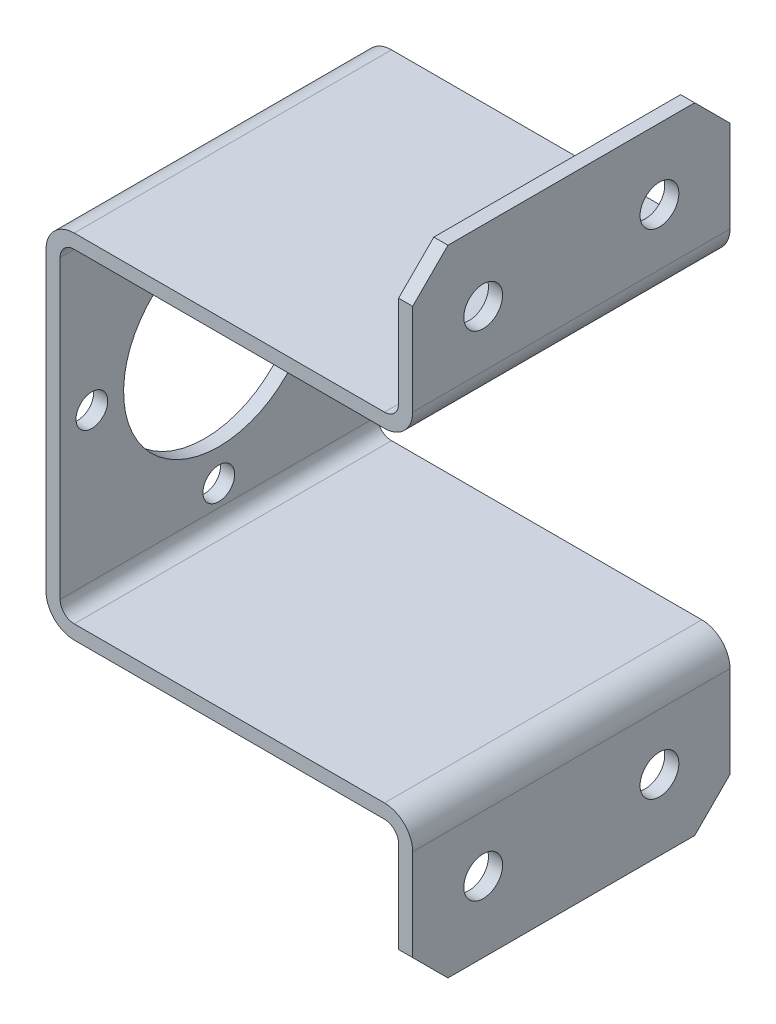
ISO-10303-21;
HEADER;
FILE_DESCRIPTION(('STEP AP214'),'2;1');
FILE_NAME('part.step','',(''),(''),'','','');
FILE_SCHEMA(('AUTOMOTIVE_DESIGN { 1 0 10303 214 1 1 1 1 }'));
ENDSEC;
DATA;
#1=APPLICATION_CONTEXT('core data for automotive mechanical design processes');
#2=APPLICATION_PROTOCOL_DEFINITION('international standard','automotive_design',2000,#1);
#3=PRODUCT_CONTEXT('',#1,'mechanical');
#4=PRODUCT('Part','Part','',(#3));
#5=PRODUCT_RELATED_PRODUCT_CATEGORY('part','',(#4));
#6=PRODUCT_DEFINITION_FORMATION('','',#4);
#7=PRODUCT_DEFINITION_CONTEXT('part definition',#1,'design');
#8=PRODUCT_DEFINITION('design','',#6,#7);
#9=PRODUCT_DEFINITION_SHAPE('','',#8);
#10=(LENGTH_UNIT() NAMED_UNIT(*) SI_UNIT(.MILLI.,.METRE.));
#11=(NAMED_UNIT(*) PLANE_ANGLE_UNIT() SI_UNIT($,.RADIAN.));
#12=(NAMED_UNIT(*) SI_UNIT($,.STERADIAN.) SOLID_ANGLE_UNIT());
#13=UNCERTAINTY_MEASURE_WITH_UNIT(LENGTH_MEASURE(1.E-05),#10,'distance_accuracy_value','');
#14=(GEOMETRIC_REPRESENTATION_CONTEXT(3) GLOBAL_UNCERTAINTY_ASSIGNED_CONTEXT((#13)) GLOBAL_UNIT_ASSIGNED_CONTEXT((#10,
#11,#12)) REPRESENTATION_CONTEXT('',''));
#15=CARTESIAN_POINT('',(0.,0.,0.));
#16=DIRECTION('',(0.,0.,1.));
#17=DIRECTION('',(1.,0.,0.));
#18=AXIS2_PLACEMENT_3D('',#15,#16,#17);
#19=CARTESIAN_POINT('',(50.,70.,22.5));
#20=DIRECTION('',(1.,0.,0.));
#21=DIRECTION('',(0.,0.,-1.));
#22=AXIS2_PLACEMENT_3D('',#19,#20,#21);
#23=PLANE('',#22);
#24=CARTESIAN_POINT('',(50.,60.,12.5));
#25=DIRECTION('',(-1.,0.,0.));
#26=DIRECTION('',(0.,0.,1.));
#27=AXIS2_PLACEMENT_3D('',#24,#25,#26);
#28=CIRCLE('',#27,2.75);
#29=CARTESIAN_POINT('',(50.,60.,15.25));
#30=VERTEX_POINT('',#29);
#31=EDGE_CURVE('E423',#30,#30,#28,.T.);
#32=ORIENTED_EDGE('',*,*,#31,.F.);
#33=EDGE_LOOP('',(#32));
#34=FACE_BOUND('',#33,.T.);
#35=DIRECTION('',(0.,0.,-1.));
#36=VECTOR('',#35,1.);
#37=CARTESIAN_POINT('',(50.,70.,22.5));
#38=LINE('',#37,#36);
#39=CARTESIAN_POINT('',(50.,70.,17.5));
#40=VERTEX_POINT('',#39);
#41=CARTESIAN_POINT('',(50.,70.,-17.5));
#42=VERTEX_POINT('',#41);
#43=EDGE_CURVE('E240',#40,#42,#38,.T.);
#44=ORIENTED_EDGE('',*,*,#43,.T.);
#45=DIRECTION('',(0.,0.707106781186549,0.707106781186547));
#46=VECTOR('',#45,1.);
#47=CARTESIAN_POINT('',(50.,70.,-17.5));
#48=LINE('',#47,#46);
#49=CARTESIAN_POINT('',(50.,65.,-22.5));
#50=VERTEX_POINT('',#49);
#51=EDGE_CURVE('E283',#42,#50,#48,.F.);
#52=ORIENTED_EDGE('',*,*,#51,.T.);
#53=DIRECTION('',(0.,-1.,0.));
#54=VECTOR('',#53,1.);
#55=CARTESIAN_POINT('',(50.,70.,-22.5));
#56=LINE('',#55,#54);
#57=CARTESIAN_POINT('',(50.,52.,-22.5));
#58=VERTEX_POINT('',#57);
#59=EDGE_CURVE('E355',#50,#58,#56,.T.);
#60=ORIENTED_EDGE('',*,*,#59,.T.);
#61=DIRECTION('',(0.,0.,-1.));
#62=VECTOR('',#61,1.);
#63=CARTESIAN_POINT('',(50.,52.,22.5));
#64=LINE('',#63,#62);
#65=CARTESIAN_POINT('',(50.,52.,22.5));
#66=VERTEX_POINT('',#65);
#67=EDGE_CURVE('E254',#58,#66,#64,.F.);
#68=ORIENTED_EDGE('',*,*,#67,.T.);
#69=DIRECTION('',(0.,-1.,0.));
#70=VECTOR('',#69,1.);
#71=CARTESIAN_POINT('',(50.,70.,22.5));
#72=LINE('',#71,#70);
#73=CARTESIAN_POINT('',(50.,65.,22.5));
#74=VERTEX_POINT('',#73);
#75=EDGE_CURVE('E403',#74,#66,#72,.T.);
#76=ORIENTED_EDGE('',*,*,#75,.F.);
#77=DIRECTION('',(0.,0.707106781186547,-0.707106781186547));
#78=VECTOR('',#77,1.);
#79=CARTESIAN_POINT('',(50.,65.,22.5));
#80=LINE('',#79,#78);
#81=EDGE_CURVE('E281',#74,#40,#80,.T.);
#82=ORIENTED_EDGE('',*,*,#81,.T.);
#83=EDGE_LOOP('',(#44,#52,#60,#68,#76,#82));
#84=FACE_BOUND('',#83,.T.);
#85=CARTESIAN_POINT('',(50.,60.,-12.5));
#86=DIRECTION('',(-1.,0.,0.));
#87=DIRECTION('',(0.,0.,1.));
#88=AXIS2_PLACEMENT_3D('',#85,#86,#87);
#89=CIRCLE('',#88,2.75);
#90=CARTESIAN_POINT('',(50.,60.,-9.75));
#91=VERTEX_POINT('',#90);
#92=EDGE_CURVE('E417',#91,#91,#89,.T.);
#93=ORIENTED_EDGE('',*,*,#92,.F.);
#94=EDGE_LOOP('',(#93));
#95=FACE_BOUND('',#94,.T.);
#96=ADVANCED_FACE('F34',(#34,#84,#95),#23,.F.);
#97=CARTESIAN_POINT('',(52.,48.,22.5));
#98=DIRECTION('',(-1.,0.,0.));
#99=DIRECTION('',(0.,-1.,0.));
#100=AXIS2_PLACEMENT_3D('',#97,#98,#99);
#101=PLANE('',#100);
#102=CARTESIAN_POINT('',(52.,60.,12.5));
#103=DIRECTION('',(-1.,0.,0.));
#104=DIRECTION('',(0.,-1.,0.));
#105=AXIS2_PLACEMENT_3D('',#102,#103,#104);
#106=CIRCLE('',#105,2.75);
#107=CARTESIAN_POINT('',(52.,57.25,12.5));
#108=VERTEX_POINT('',#107);
#109=EDGE_CURVE('E420',#108,#108,#106,.T.);
#110=ORIENTED_EDGE('',*,*,#109,.T.);
#111=EDGE_LOOP('',(#110));
#112=FACE_BOUND('',#111,.T.);
#113=CARTESIAN_POINT('',(52.,60.,-12.5));
#114=DIRECTION('',(-1.,0.,0.));
#115=DIRECTION('',(0.,-1.,0.));
#116=AXIS2_PLACEMENT_3D('',#113,#114,#115);
#117=CIRCLE('',#116,2.75);
#118=CARTESIAN_POINT('',(52.,57.25,-12.5));
#119=VERTEX_POINT('',#118);
#120=EDGE_CURVE('E414',#119,#119,#117,.T.);
#121=ORIENTED_EDGE('',*,*,#120,.T.);
#122=EDGE_LOOP('',(#121));
#123=FACE_BOUND('',#122,.T.);
#124=DIRECTION('',(0.,1.,0.));
#125=VECTOR('',#124,1.);
#126=CARTESIAN_POINT('',(52.,48.,22.5));
#127=LINE('',#126,#125);
#128=CARTESIAN_POINT('',(52.,52.,22.5));
#129=VERTEX_POINT('',#128);
#130=CARTESIAN_POINT('',(52.,65.,22.5));
#131=VERTEX_POINT('',#130);
#132=EDGE_CURVE('E227',#129,#131,#127,.T.);
#133=ORIENTED_EDGE('',*,*,#132,.F.);
#134=DIRECTION('',(0.,0.,-1.));
#135=VECTOR('',#134,1.);
#136=CARTESIAN_POINT('',(52.,52.,22.5));
#137=LINE('',#136,#135);
#138=CARTESIAN_POINT('',(52.,52.,-22.5));
#139=VERTEX_POINT('',#138);
#140=EDGE_CURVE('E42',#129,#139,#137,.T.);
#141=ORIENTED_EDGE('',*,*,#140,.T.);
#142=DIRECTION('',(0.,1.,0.));
#143=VECTOR('',#142,1.);
#144=CARTESIAN_POINT('',(52.,48.,-22.5));
#145=LINE('',#144,#143);
#146=CARTESIAN_POINT('',(52.,65.,-22.5));
#147=VERTEX_POINT('',#146);
#148=EDGE_CURVE('E349',#139,#147,#145,.T.);
#149=ORIENTED_EDGE('',*,*,#148,.T.);
#150=DIRECTION('',(0.,-0.707106781186549,-0.707106781186547));
#151=VECTOR('',#150,1.);
#152=CARTESIAN_POINT('',(52.,70.,-17.5));
#153=LINE('',#152,#151);
#154=CARTESIAN_POINT('',(52.,70.,-17.5));
#155=VERTEX_POINT('',#154);
#156=EDGE_CURVE('E293',#147,#155,#153,.F.);
#157=ORIENTED_EDGE('',*,*,#156,.T.);
#158=DIRECTION('',(0.,0.,-1.));
#159=VECTOR('',#158,1.);
#160=CARTESIAN_POINT('',(52.,70.,22.5));
#161=LINE('',#160,#159);
#162=CARTESIAN_POINT('',(52.,70.,17.5));
#163=VERTEX_POINT('',#162);
#164=EDGE_CURVE('E243',#163,#155,#161,.T.);
#165=ORIENTED_EDGE('',*,*,#164,.F.);
#166=DIRECTION('',(0.,-0.707106781186547,0.707106781186547));
#167=VECTOR('',#166,1.);
#168=CARTESIAN_POINT('',(52.,65.,22.5));
#169=LINE('',#168,#167);
#170=EDGE_CURVE('E290',#163,#131,#169,.T.);
#171=ORIENTED_EDGE('',*,*,#170,.T.);
#172=EDGE_LOOP('',(#133,#141,#149,#157,#165,#171));
#173=FACE_BOUND('',#172,.T.);
#174=ADVANCED_FACE('F348',(#112,#123,#173),#101,.F.);
#175=CARTESIAN_POINT('',(52.,70.,22.5));
#176=DIRECTION('',(0.,-1.,0.));
#177=DIRECTION('',(0.,0.,-1.));
#178=AXIS2_PLACEMENT_3D('',#175,#176,#177);
#179=PLANE('',#178);
#180=ORIENTED_EDGE('',*,*,#164,.T.);
#181=DIRECTION('',(-1.,0.,0.));
#182=VECTOR('',#181,1.);
#183=CARTESIAN_POINT('',(52.,70.,-17.5));
#184=LINE('',#183,#182);
#185=EDGE_CURVE('E278',#155,#42,#184,.T.);
#186=ORIENTED_EDGE('',*,*,#185,.T.);
#187=ORIENTED_EDGE('',*,*,#43,.F.);
#188=DIRECTION('',(1.,0.,0.));
#189=VECTOR('',#188,1.);
#190=CARTESIAN_POINT('',(52.,70.,17.5));
#191=LINE('',#190,#189);
#192=EDGE_CURVE('E276',#40,#163,#191,.T.);
#193=ORIENTED_EDGE('',*,*,#192,.T.);
#194=EDGE_LOOP('',(#180,#186,#187,#193));
#195=FACE_BOUND('',#194,.T.);
#196=ADVANCED_FACE('F497',(#195),#179,.F.);
#197=CARTESIAN_POINT('',(50.,50.,22.5));
#198=DIRECTION('',(0.,-1.,0.));
#199=DIRECTION('',(1.,0.,0.));
#200=AXIS2_PLACEMENT_3D('',#197,#198,#199);
#201=PLANE('',#200);
#202=DIRECTION('',(-1.,0.,0.));
#203=VECTOR('',#202,1.);
#204=CARTESIAN_POINT('',(50.,50.,-22.5));
#205=LINE('',#204,#203);
#206=CARTESIAN_POINT('',(48.,50.,-22.5));
#207=VERTEX_POINT('',#206);
#208=CARTESIAN_POINT('',(4.,50.,-22.5));
#209=VERTEX_POINT('',#208);
#210=EDGE_CURVE('E358',#207,#209,#205,.T.);
#211=ORIENTED_EDGE('',*,*,#210,.T.);
#212=DIRECTION('',(0.,0.,-1.));
#213=VECTOR('',#212,1.);
#214=CARTESIAN_POINT('',(4.,50.,22.5));
#215=LINE('',#214,#213);
#216=CARTESIAN_POINT('',(4.,50.,22.5));
#217=VERTEX_POINT('',#216);
#218=EDGE_CURVE('E327',#209,#217,#215,.F.);
#219=ORIENTED_EDGE('',*,*,#218,.T.);
#220=DIRECTION('',(-1.,0.,0.));
#221=VECTOR('',#220,1.);
#222=CARTESIAN_POINT('',(50.,50.,22.5));
#223=LINE('',#222,#221);
#224=CARTESIAN_POINT('',(48.,50.,22.5));
#225=VERTEX_POINT('',#224);
#226=EDGE_CURVE('E400',#225,#217,#223,.T.);
#227=ORIENTED_EDGE('',*,*,#226,.F.);
#228=DIRECTION('',(0.,0.,-1.));
#229=VECTOR('',#228,1.);
#230=CARTESIAN_POINT('',(48.,50.,-22.5));
#231=LINE('',#230,#229);
#232=EDGE_CURVE('E251',#225,#207,#231,.T.);
#233=ORIENTED_EDGE('',*,*,#232,.T.);
#234=EDGE_LOOP('',(#211,#219,#227,#233));
#235=FACE_BOUND('',#234,.T.);
#236=ADVANCED_FACE('F464',(#235),#201,.F.);
#237=CARTESIAN_POINT('',(0.,50.,22.5));
#238=DIRECTION('',(1.,0.,0.));
#239=DIRECTION('',(0.,1.,0.));
#240=AXIS2_PLACEMENT_3D('',#237,#238,#239);
#241=PLANE('',#240);
#242=CARTESIAN_POINT('',(0.,25.,0.));
#243=DIRECTION('',(-1.,0.,0.));
#244=DIRECTION('',(0.,-1.,0.));
#245=AXIS2_PLACEMENT_3D('',#242,#243,#244);
#246=CIRCLE('',#245,13.5);
#247=CARTESIAN_POINT('',(0.,11.5,0.));
#248=VERTEX_POINT('',#247);
#249=EDGE_CURVE('E453',#248,#248,#246,.T.);
#250=ORIENTED_EDGE('',*,*,#249,.F.);
#251=EDGE_LOOP('',(#250));
#252=FACE_BOUND('',#251,.T.);
#253=CARTESIAN_POINT('',(0.,24.9999999999998,-18.));
#254=DIRECTION('',(-1.,0.,0.));
#255=DIRECTION('',(0.,0.,1.));
#256=AXIS2_PLACEMENT_3D('',#253,#254,#255);
#257=CIRCLE('',#256,2.24999999999999);
#258=CARTESIAN_POINT('',(0.,24.9999999999998,-15.75));
#259=VERTEX_POINT('',#258);
#260=EDGE_CURVE('E447',#259,#259,#257,.T.);
#261=ORIENTED_EDGE('',*,*,#260,.F.);
#262=EDGE_LOOP('',(#261));
#263=FACE_BOUND('',#262,.T.);
#264=CARTESIAN_POINT('',(0.,43.,0.));
#265=DIRECTION('',(-1.,0.,0.));
#266=DIRECTION('',(0.,0.,1.));
#267=AXIS2_PLACEMENT_3D('',#264,#265,#266);
#268=CIRCLE('',#267,2.24999999999999);
#269=CARTESIAN_POINT('',(0.,43.,2.24999999999999));
#270=VERTEX_POINT('',#269);
#271=EDGE_CURVE('E441',#270,#270,#268,.T.);
#272=ORIENTED_EDGE('',*,*,#271,.F.);
#273=EDGE_LOOP('',(#272));
#274=FACE_BOUND('',#273,.T.);
#275=CARTESIAN_POINT('',(0.,25.0000000000001,18.));
#276=DIRECTION('',(-1.,0.,0.));
#277=DIRECTION('',(0.,0.,1.));
#278=AXIS2_PLACEMENT_3D('',#275,#276,#277);
#279=CIRCLE('',#278,2.24999999999999);
#280=CARTESIAN_POINT('',(0.,25.0000000000001,20.25));
#281=VERTEX_POINT('',#280);
#282=EDGE_CURVE('E435',#281,#281,#279,.T.);
#283=ORIENTED_EDGE('',*,*,#282,.F.);
#284=EDGE_LOOP('',(#283));
#285=FACE_BOUND('',#284,.T.);
#286=CARTESIAN_POINT('',(0.,6.99999999999999,0.));
#287=DIRECTION('',(-1.,0.,0.));
#288=DIRECTION('',(0.,0.,1.));
#289=AXIS2_PLACEMENT_3D('',#286,#287,#288);
#290=CIRCLE('',#289,2.24999999999999);
#291=CARTESIAN_POINT('',(0.,6.99999999999999,2.24999999999999));
#292=VERTEX_POINT('',#291);
#293=EDGE_CURVE('E429',#292,#292,#290,.T.);
#294=ORIENTED_EDGE('',*,*,#293,.F.);
#295=EDGE_LOOP('',(#294));
#296=FACE_BOUND('',#295,.T.);
#297=DIRECTION('',(0.,-1.,0.));
#298=VECTOR('',#297,1.);
#299=CARTESIAN_POINT('',(0.,50.,22.5));
#300=LINE('',#299,#298);
#301=CARTESIAN_POINT('',(0.,46.,22.5));
#302=VERTEX_POINT('',#301);
#303=CARTESIAN_POINT('',(0.,4.00000000000001,22.5));
#304=VERTEX_POINT('',#303);
#305=EDGE_CURVE('E397',#302,#304,#300,.T.);
#306=ORIENTED_EDGE('',*,*,#305,.F.);
#307=DIRECTION('',(0.,0.,-1.));
#308=VECTOR('',#307,1.);
#309=CARTESIAN_POINT('',(0.,46.,22.5));
#310=LINE('',#309,#308);
#311=CARTESIAN_POINT('',(0.,46.,-22.5));
#312=VERTEX_POINT('',#311);
#313=EDGE_CURVE('E316',#302,#312,#310,.T.);
#314=ORIENTED_EDGE('',*,*,#313,.T.);
#315=DIRECTION('',(0.,-1.,0.));
#316=VECTOR('',#315,1.);
#317=CARTESIAN_POINT('',(0.,50.,-22.5));
#318=LINE('',#317,#316);
#319=CARTESIAN_POINT('',(0.,4.00000000000001,-22.5));
#320=VERTEX_POINT('',#319);
#321=EDGE_CURVE('E368',#312,#320,#318,.T.);
#322=ORIENTED_EDGE('',*,*,#321,.T.);
#323=DIRECTION('',(0.,0.,-1.));
#324=VECTOR('',#323,1.);
#325=CARTESIAN_POINT('',(0.,4.,22.5));
#326=LINE('',#325,#324);
#327=EDGE_CURVE('E314',#320,#304,#326,.F.);
#328=ORIENTED_EDGE('',*,*,#327,.T.);
#329=EDGE_LOOP('',(#306,#314,#322,#328));
#330=FACE_BOUND('',#329,.T.);
#331=ADVANCED_FACE('F460',(#252,#263,#274,#285,#296,#330),#241,.F.);
#332=CARTESIAN_POINT('',(0.,0.,22.5));
#333=DIRECTION('',(0.,1.,0.));
#334=DIRECTION('',(0.,0.,1.));
#335=AXIS2_PLACEMENT_3D('',#332,#333,#334);
#336=PLANE('',#335);
#337=DIRECTION('',(1.,0.,0.));
#338=VECTOR('',#337,1.);
#339=CARTESIAN_POINT('',(0.,0.,22.5));
#340=LINE('',#339,#338);
#341=CARTESIAN_POINT('',(4.,0.,22.5));
#342=VERTEX_POINT('',#341);
#343=CARTESIAN_POINT('',(48.,0.,22.5));
#344=VERTEX_POINT('',#343);
#345=EDGE_CURVE('E395',#342,#344,#340,.T.);
#346=ORIENTED_EDGE('',*,*,#345,.F.);
#347=DIRECTION('',(0.,0.,-1.));
#348=VECTOR('',#347,1.);
#349=CARTESIAN_POINT('',(4.,0.,22.5));
#350=LINE('',#349,#348);
#351=CARTESIAN_POINT('',(4.,0.,-22.5));
#352=VERTEX_POINT('',#351);
#353=EDGE_CURVE('E336',#342,#352,#350,.T.);
#354=ORIENTED_EDGE('',*,*,#353,.T.);
#355=DIRECTION('',(1.,0.,0.));
#356=VECTOR('',#355,1.);
#357=CARTESIAN_POINT('',(0.,0.,-22.5));
#358=LINE('',#357,#356);
#359=CARTESIAN_POINT('',(48.,0.,-22.5));
#360=VERTEX_POINT('',#359);
#361=EDGE_CURVE('E371',#352,#360,#358,.T.);
#362=ORIENTED_EDGE('',*,*,#361,.T.);
#363=DIRECTION('',(0.,0.,-1.));
#364=VECTOR('',#363,1.);
#365=CARTESIAN_POINT('',(48.,0.,22.5));
#366=LINE('',#365,#364);
#367=EDGE_CURVE('E208',#360,#344,#366,.F.);
#368=ORIENTED_EDGE('',*,*,#367,.T.);
#369=EDGE_LOOP('',(#346,#354,#362,#368));
#370=FACE_BOUND('',#369,.T.);
#371=ADVANCED_FACE('F463',(#370),#336,.F.);
#372=CARTESIAN_POINT('',(50.,0.,22.5));
#373=DIRECTION('',(1.,0.,0.));
#374=DIRECTION('',(0.,0.,-1.));
#375=AXIS2_PLACEMENT_3D('',#372,#373,#374);
#376=PLANE('',#375);
#377=CARTESIAN_POINT('',(50.,-10.,-12.5));
#378=DIRECTION('',(-1.,0.,0.));
#379=DIRECTION('',(0.,0.,1.));
#380=AXIS2_PLACEMENT_3D('',#377,#378,#379);
#381=CIRCLE('',#380,2.74999999999999);
#382=CARTESIAN_POINT('',(50.,-10.,-9.75000000000001));
#383=VERTEX_POINT('',#382);
#384=EDGE_CURVE('E411',#383,#383,#381,.T.);
#385=ORIENTED_EDGE('',*,*,#384,.F.);
#386=EDGE_LOOP('',(#385));
#387=FACE_BOUND('',#386,.T.);
#388=CARTESIAN_POINT('',(50.,-10.,12.5));
#389=DIRECTION('',(-1.,0.,0.));
#390=DIRECTION('',(0.,0.,1.));
#391=AXIS2_PLACEMENT_3D('',#388,#389,#390);
#392=CIRCLE('',#391,2.74999999999999);
#393=CARTESIAN_POINT('',(50.,-10.,15.25));
#394=VERTEX_POINT('',#393);
#395=EDGE_CURVE('E361',#394,#394,#392,.T.);
#396=ORIENTED_EDGE('',*,*,#395,.F.);
#397=EDGE_LOOP('',(#396));
#398=FACE_BOUND('',#397,.T.);
#399=DIRECTION('',(0.,0.,-1.));
#400=VECTOR('',#399,1.);
#401=CARTESIAN_POINT('',(50.,-20.,22.5));
#402=LINE('',#401,#400);
#403=CARTESIAN_POINT('',(50.,-20.,17.5));
#404=VERTEX_POINT('',#403);
#405=CARTESIAN_POINT('',(50.,-20.,-17.5));
#406=VERTEX_POINT('',#405);
#407=EDGE_CURVE('E236',#404,#406,#402,.T.);
#408=ORIENTED_EDGE('',*,*,#407,.F.);
#409=DIRECTION('',(0.,0.707106781186547,0.707106781186549));
#410=VECTOR('',#409,1.);
#411=CARTESIAN_POINT('',(50.,-15.,22.5));
#412=LINE('',#411,#410);
#413=CARTESIAN_POINT('',(50.,-15.,22.5));
#414=VERTEX_POINT('',#413);
#415=EDGE_CURVE('E312',#404,#414,#412,.T.);
#416=ORIENTED_EDGE('',*,*,#415,.T.);
#417=DIRECTION('',(0.,-1.,0.));
#418=VECTOR('',#417,1.);
#419=CARTESIAN_POINT('',(50.,0.,22.5));
#420=LINE('',#419,#418);
#421=CARTESIAN_POINT('',(50.,-2.,22.5));
#422=VERTEX_POINT('',#421);
#423=EDGE_CURVE('E390',#422,#414,#420,.T.);
#424=ORIENTED_EDGE('',*,*,#423,.F.);
#425=DIRECTION('',(0.,0.,-1.));
#426=VECTOR('',#425,1.);
#427=CARTESIAN_POINT('',(50.,-2.,-22.5));
#428=LINE('',#427,#426);
#429=CARTESIAN_POINT('',(50.,-2.,-22.5));
#430=VERTEX_POINT('',#429);
#431=EDGE_CURVE('E257',#422,#430,#428,.T.);
#432=ORIENTED_EDGE('',*,*,#431,.T.);
#433=DIRECTION('',(0.,-1.,0.));
#434=VECTOR('',#433,1.);
#435=CARTESIAN_POINT('',(50.,0.,-22.5));
#436=LINE('',#435,#434);
#437=CARTESIAN_POINT('',(50.,-15.,-22.5));
#438=VERTEX_POINT('',#437);
#439=EDGE_CURVE('E373',#430,#438,#436,.T.);
#440=ORIENTED_EDGE('',*,*,#439,.T.);
#441=DIRECTION('',(0.,0.707106781186549,-0.707106781186547));
#442=VECTOR('',#441,1.);
#443=CARTESIAN_POINT('',(50.,-20.,-17.5));
#444=LINE('',#443,#442);
#445=EDGE_CURVE('E310',#438,#406,#444,.F.);
#446=ORIENTED_EDGE('',*,*,#445,.T.);
#447=EDGE_LOOP('',(#408,#416,#424,#432,#440,#446));
#448=FACE_BOUND('',#447,.T.);
#449=ADVANCED_FACE('F551',(#387,#398,#448),#376,.F.);
#450=CARTESIAN_POINT('',(50.,-20.,22.5));
#451=DIRECTION('',(0.,1.,0.));
#452=DIRECTION('',(0.,0.,1.));
#453=AXIS2_PLACEMENT_3D('',#450,#451,#452);
#454=PLANE('',#453);
#455=DIRECTION('',(0.,0.,-1.));
#456=VECTOR('',#455,1.);
#457=CARTESIAN_POINT('',(52.,-20.,22.5));
#458=LINE('',#457,#456);
#459=CARTESIAN_POINT('',(52.,-20.,17.5));
#460=VERTEX_POINT('',#459);
#461=CARTESIAN_POINT('',(52.,-20.,-17.5));
#462=VERTEX_POINT('',#461);
#463=EDGE_CURVE('E233',#460,#462,#458,.T.);
#464=ORIENTED_EDGE('',*,*,#463,.F.);
#465=DIRECTION('',(-1.,0.,0.));
#466=VECTOR('',#465,1.);
#467=CARTESIAN_POINT('',(50.,-20.,17.5));
#468=LINE('',#467,#466);
#469=EDGE_CURVE('E308',#460,#404,#468,.T.);
#470=ORIENTED_EDGE('',*,*,#469,.T.);
#471=ORIENTED_EDGE('',*,*,#407,.T.);
#472=DIRECTION('',(1.,0.,0.));
#473=VECTOR('',#472,1.);
#474=CARTESIAN_POINT('',(50.,-20.,-17.5));
#475=LINE('',#474,#473);
#476=EDGE_CURVE('E305',#406,#462,#475,.T.);
#477=ORIENTED_EDGE('',*,*,#476,.T.);
#478=EDGE_LOOP('',(#464,#470,#471,#477));
#479=FACE_BOUND('',#478,.T.);
#480=ADVANCED_FACE('F547',(#479),#454,.F.);
#481=CARTESIAN_POINT('',(52.,-20.,22.5));
#482=DIRECTION('',(-1.,0.,0.));
#483=DIRECTION('',(0.,0.,1.));
#484=AXIS2_PLACEMENT_3D('',#481,#482,#483);
#485=PLANE('',#484);
#486=CARTESIAN_POINT('',(52.,-10.,-12.5));
#487=DIRECTION('',(-1.,0.,0.));
#488=DIRECTION('',(0.,0.,1.));
#489=AXIS2_PLACEMENT_3D('',#486,#487,#488);
#490=CIRCLE('',#489,2.74999999999999);
#491=CARTESIAN_POINT('',(52.,-10.,-9.75000000000001));
#492=VERTEX_POINT('',#491);
#493=EDGE_CURVE('E408',#492,#492,#490,.T.);
#494=ORIENTED_EDGE('',*,*,#493,.T.);
#495=EDGE_LOOP('',(#494));
#496=FACE_BOUND('',#495,.T.);
#497=CARTESIAN_POINT('',(52.,-10.,12.5));
#498=DIRECTION('',(-1.,0.,0.));
#499=DIRECTION('',(0.,0.,1.));
#500=AXIS2_PLACEMENT_3D('',#497,#498,#499);
#501=CIRCLE('',#500,2.74999999999999);
#502=CARTESIAN_POINT('',(52.,-10.,15.25));
#503=VERTEX_POINT('',#502);
#504=EDGE_CURVE('E356',#503,#503,#501,.T.);
#505=ORIENTED_EDGE('',*,*,#504,.T.);
#506=EDGE_LOOP('',(#505));
#507=FACE_BOUND('',#506,.T.);
#508=DIRECTION('',(0.,1.,0.));
#509=VECTOR('',#508,1.);
#510=CARTESIAN_POINT('',(52.,-20.,-22.5));
#511=LINE('',#510,#509);
#512=CARTESIAN_POINT('',(52.,-15.,-22.5));
#513=VERTEX_POINT('',#512);
#514=CARTESIAN_POINT('',(52.,-2.,-22.5));
#515=VERTEX_POINT('',#514);
#516=EDGE_CURVE('E229',#513,#515,#511,.T.);
#517=ORIENTED_EDGE('',*,*,#516,.T.);
#518=DIRECTION('',(0.,0.,-1.));
#519=VECTOR('',#518,1.);
#520=CARTESIAN_POINT('',(52.,-2.,22.5));
#521=LINE('',#520,#519);
#522=CARTESIAN_POINT('',(52.,-2.,22.5));
#523=VERTEX_POINT('',#522);
#524=EDGE_CURVE('E342',#515,#523,#521,.F.);
#525=ORIENTED_EDGE('',*,*,#524,.T.);
#526=DIRECTION('',(0.,1.,0.));
#527=VECTOR('',#526,1.);
#528=CARTESIAN_POINT('',(52.,-20.,22.5));
#529=LINE('',#528,#527);
#530=CARTESIAN_POINT('',(52.,-15.,22.5));
#531=VERTEX_POINT('',#530);
#532=EDGE_CURVE('E388',#531,#523,#529,.T.);
#533=ORIENTED_EDGE('',*,*,#532,.F.);
#534=DIRECTION('',(0.,-0.707106781186547,-0.707106781186549));
#535=VECTOR('',#534,1.);
#536=CARTESIAN_POINT('',(52.,-15.,22.5));
#537=LINE('',#536,#535);
#538=EDGE_CURVE('E303',#531,#460,#537,.T.);
#539=ORIENTED_EDGE('',*,*,#538,.T.);
#540=ORIENTED_EDGE('',*,*,#463,.T.);
#541=DIRECTION('',(0.,-0.707106781186549,0.707106781186547));
#542=VECTOR('',#541,1.);
#543=CARTESIAN_POINT('',(52.,-20.,-17.5));
#544=LINE('',#543,#542);
#545=EDGE_CURVE('E301',#462,#513,#544,.F.);
#546=ORIENTED_EDGE('',*,*,#545,.T.);
#547=EDGE_LOOP('',(#517,#525,#533,#539,#540,#546));
#548=FACE_BOUND('',#547,.T.);
#549=ADVANCED_FACE('F379',(#496,#507,#548),#485,.F.);
#550=CARTESIAN_POINT('',(52.,2.,22.5));
#551=DIRECTION('',(0.,-1.,0.));
#552=DIRECTION('',(1.,0.,0.));
#553=AXIS2_PLACEMENT_3D('',#550,#551,#552);
#554=PLANE('',#553);
#555=DIRECTION('',(-1.,0.,0.));
#556=VECTOR('',#555,1.);
#557=CARTESIAN_POINT('',(52.,2.,22.5));
#558=LINE('',#557,#556);
#559=CARTESIAN_POINT('',(48.,2.,22.5));
#560=VERTEX_POINT('',#559);
#561=CARTESIAN_POINT('',(4.00000000000001,1.99999999999999,22.5));
#562=VERTEX_POINT('',#561);
#563=EDGE_CURVE('E387',#560,#562,#558,.T.);
#564=ORIENTED_EDGE('',*,*,#563,.F.);
#565=DIRECTION('',(0.,0.,-1.));
#566=VECTOR('',#565,1.);
#567=CARTESIAN_POINT('',(48.,2.,22.5));
#568=LINE('',#567,#566);
#569=CARTESIAN_POINT('',(48.,2.,-22.5));
#570=VERTEX_POINT('',#569);
#571=EDGE_CURVE('E339',#560,#570,#568,.T.);
#572=ORIENTED_EDGE('',*,*,#571,.T.);
#573=DIRECTION('',(-1.,0.,0.));
#574=VECTOR('',#573,1.);
#575=CARTESIAN_POINT('',(52.,2.,-22.5));
#576=LINE('',#575,#574);
#577=CARTESIAN_POINT('',(4.00000000000001,1.99999999999999,-22.5));
#578=VERTEX_POINT('',#577);
#579=EDGE_CURVE('E225',#570,#578,#576,.T.);
#580=ORIENTED_EDGE('',*,*,#579,.T.);
#581=DIRECTION('',(0.,0.,-1.));
#582=VECTOR('',#581,1.);
#583=CARTESIAN_POINT('',(4.00000000000001,1.99999999999999,22.5));
#584=LINE('',#583,#582);
#585=EDGE_CURVE('E203',#578,#562,#584,.F.);
#586=ORIENTED_EDGE('',*,*,#585,.T.);
#587=EDGE_LOOP('',(#564,#572,#580,#586));
#588=FACE_BOUND('',#587,.T.);
#589=ADVANCED_FACE('F386',(#588),#554,.F.);
#590=CARTESIAN_POINT('',(2.00000000000001,1.99999999999999,22.5));
#591=DIRECTION('',(-1.,0.,0.));
#592=DIRECTION('',(0.,-1.,0.));
#593=AXIS2_PLACEMENT_3D('',#590,#591,#592);
#594=PLANE('',#593);
#595=CARTESIAN_POINT('',(2.00000000000001,25.,0.));
#596=DIRECTION('',(-1.,0.,0.));
#597=DIRECTION('',(0.,-1.,0.));
#598=AXIS2_PLACEMENT_3D('',#595,#596,#597);
#599=CIRCLE('',#598,13.5);
#600=CARTESIAN_POINT('',(2.00000000000001,11.5,0.));
#601=VERTEX_POINT('',#600);
#602=EDGE_CURVE('E450',#601,#601,#599,.F.);
#603=ORIENTED_EDGE('',*,*,#602,.F.);
#604=EDGE_LOOP('',(#603));
#605=FACE_BOUND('',#604,.T.);
#606=CARTESIAN_POINT('',(2.00000000000001,24.9999999999998,-18.));
#607=DIRECTION('',(-1.,0.,0.));
#608=DIRECTION('',(0.,-1.,0.));
#609=AXIS2_PLACEMENT_3D('',#606,#607,#608);
#610=CIRCLE('',#609,2.24999999999999);
#611=CARTESIAN_POINT('',(2.00000000000001,22.7499999999998,-18.));
#612=VERTEX_POINT('',#611);
#613=EDGE_CURVE('E444',#612,#612,#610,.T.);
#614=ORIENTED_EDGE('',*,*,#613,.T.);
#615=EDGE_LOOP('',(#614));
#616=FACE_BOUND('',#615,.T.);
#617=CARTESIAN_POINT('',(2.00000000000001,43.,0.));
#618=DIRECTION('',(-1.,0.,0.));
#619=DIRECTION('',(0.,-1.,0.));
#620=AXIS2_PLACEMENT_3D('',#617,#618,#619);
#621=CIRCLE('',#620,2.25);
#622=CARTESIAN_POINT('',(2.00000000000001,40.75,0.));
#623=VERTEX_POINT('',#622);
#624=EDGE_CURVE('E438',#623,#623,#621,.T.);
#625=ORIENTED_EDGE('',*,*,#624,.T.);
#626=EDGE_LOOP('',(#625));
#627=FACE_BOUND('',#626,.T.);
#628=CARTESIAN_POINT('',(2.00000000000001,25.0000000000001,18.));
#629=DIRECTION('',(-1.,0.,0.));
#630=DIRECTION('',(0.,-1.,0.));
#631=AXIS2_PLACEMENT_3D('',#628,#629,#630);
#632=CIRCLE('',#631,2.24999999999999);
#633=CARTESIAN_POINT('',(2.00000000000001,22.7500000000001,18.));
#634=VERTEX_POINT('',#633);
#635=EDGE_CURVE('E432',#634,#634,#632,.T.);
#636=ORIENTED_EDGE('',*,*,#635,.T.);
#637=EDGE_LOOP('',(#636));
#638=FACE_BOUND('',#637,.T.);
#639=CARTESIAN_POINT('',(2.00000000000001,6.99999999999999,0.));
#640=DIRECTION('',(-1.,0.,0.));
#641=DIRECTION('',(0.,-1.,0.));
#642=AXIS2_PLACEMENT_3D('',#639,#640,#641);
#643=CIRCLE('',#642,2.24999999999999);
#644=CARTESIAN_POINT('',(2.00000000000001,4.75,0.));
#645=VERTEX_POINT('',#644);
#646=EDGE_CURVE('E426',#645,#645,#643,.T.);
#647=ORIENTED_EDGE('',*,*,#646,.T.);
#648=EDGE_LOOP('',(#647));
#649=FACE_BOUND('',#648,.T.);
#650=DIRECTION('',(0.,1.,0.));
#651=VECTOR('',#650,1.);
#652=CARTESIAN_POINT('',(2.00000000000001,1.99999999999999,22.5));
#653=LINE('',#652,#651);
#654=CARTESIAN_POINT('',(2.00000000000001,3.99999999999999,22.5));
#655=VERTEX_POINT('',#654);
#656=CARTESIAN_POINT('',(2.00000000000001,46.,22.5));
#657=VERTEX_POINT('',#656);
#658=EDGE_CURVE('E217',#655,#657,#653,.T.);
#659=ORIENTED_EDGE('',*,*,#658,.F.);
#660=DIRECTION('',(0.,0.,-1.));
#661=VECTOR('',#660,1.);
#662=CARTESIAN_POINT('',(2.00000000000001,3.99999999999999,-22.5));
#663=LINE('',#662,#661);
#664=CARTESIAN_POINT('',(2.00000000000001,3.99999999999999,-22.5));
#665=VERTEX_POINT('',#664);
#666=EDGE_CURVE('E201',#655,#665,#663,.T.);
#667=ORIENTED_EDGE('',*,*,#666,.T.);
#668=DIRECTION('',(0.,1.,0.));
#669=VECTOR('',#668,1.);
#670=CARTESIAN_POINT('',(2.00000000000001,1.99999999999999,-22.5));
#671=LINE('',#670,#669);
#672=CARTESIAN_POINT('',(2.00000000000001,46.,-22.5));
#673=VERTEX_POINT('',#672);
#674=EDGE_CURVE('E214',#665,#673,#671,.T.);
#675=ORIENTED_EDGE('',*,*,#674,.T.);
#676=DIRECTION('',(0.,0.,-1.));
#677=VECTOR('',#676,1.);
#678=CARTESIAN_POINT('',(2.00000000000001,46.,22.5));
#679=LINE('',#678,#677);
#680=EDGE_CURVE('E218',#673,#657,#679,.F.);
#681=ORIENTED_EDGE('',*,*,#680,.T.);
#682=EDGE_LOOP('',(#659,#667,#675,#681));
#683=FACE_BOUND('',#682,.T.);
#684=ADVANCED_FACE('F213',(#605,#616,#627,#638,#649,#683),#594,.F.);
#685=CARTESIAN_POINT('',(2.00000000000001,48.,22.5));
#686=DIRECTION('',(0.,1.,0.));
#687=DIRECTION('',(0.,0.,1.));
#688=AXIS2_PLACEMENT_3D('',#685,#686,#687);
#689=PLANE('',#688);
#690=DIRECTION('',(1.,0.,0.));
#691=VECTOR('',#690,1.);
#692=CARTESIAN_POINT('',(2.00000000000001,48.,-22.5));
#693=LINE('',#692,#691);
#694=CARTESIAN_POINT('',(4.00000000000001,48.,-22.5));
#695=VERTEX_POINT('',#694);
#696=CARTESIAN_POINT('',(48.,48.,-22.5));
#697=VERTEX_POINT('',#696);
#698=EDGE_CURVE('E224',#695,#697,#693,.T.);
#699=ORIENTED_EDGE('',*,*,#698,.T.);
#700=DIRECTION('',(0.,0.,-1.));
#701=VECTOR('',#700,1.);
#702=CARTESIAN_POINT('',(48.,48.,22.5));
#703=LINE('',#702,#701);
#704=CARTESIAN_POINT('',(48.,48.,22.5));
#705=VERTEX_POINT('',#704);
#706=EDGE_CURVE('E11',#697,#705,#703,.F.);
#707=ORIENTED_EDGE('',*,*,#706,.T.);
#708=DIRECTION('',(1.,0.,0.));
#709=VECTOR('',#708,1.);
#710=CARTESIAN_POINT('',(2.00000000000001,48.,22.5));
#711=LINE('',#710,#709);
#712=CARTESIAN_POINT('',(4.00000000000001,48.,22.5));
#713=VERTEX_POINT('',#712);
#714=EDGE_CURVE('E237',#713,#705,#711,.T.);
#715=ORIENTED_EDGE('',*,*,#714,.F.);
#716=DIRECTION('',(0.,0.,-1.));
#717=VECTOR('',#716,1.);
#718=CARTESIAN_POINT('',(4.00000000000001,48.,-22.5));
#719=LINE('',#718,#717);
#720=EDGE_CURVE('E248',#713,#695,#719,.T.);
#721=ORIENTED_EDGE('',*,*,#720,.T.);
#722=EDGE_LOOP('',(#699,#707,#715,#721));
#723=FACE_BOUND('',#722,.T.);
#724=ADVANCED_FACE('F535',(#723),#689,.F.);
#725=CARTESIAN_POINT('',(52.,70.,22.5));
#726=DIRECTION('',(0.,0.,1.));
#727=DIRECTION('',(1.,0.,0.));
#728=AXIS2_PLACEMENT_3D('',#725,#726,#727);
#729=PLANE('',#728);
#730=ORIENTED_EDGE('',*,*,#226,.T.);
#731=CARTESIAN_POINT('',(4.,46.,22.5));
#732=DIRECTION('',(0.,0.,1.));
#733=DIRECTION('',(1.,0.,0.));
#734=AXIS2_PLACEMENT_3D('',#731,#732,#733);
#735=CIRCLE('',#734,4.);
#736=EDGE_CURVE('E334',#217,#302,#735,.T.);
#737=ORIENTED_EDGE('',*,*,#736,.T.);
#738=ORIENTED_EDGE('',*,*,#305,.T.);
#739=CARTESIAN_POINT('',(4.,4.,22.5));
#740=DIRECTION('',(0.,0.,1.));
#741=DIRECTION('',(1.,0.,0.));
#742=AXIS2_PLACEMENT_3D('',#739,#740,#741);
#743=CIRCLE('',#742,4.);
#744=EDGE_CURVE('E332',#304,#342,#743,.T.);
#745=ORIENTED_EDGE('',*,*,#744,.T.);
#746=ORIENTED_EDGE('',*,*,#345,.T.);
#747=CARTESIAN_POINT('',(48.,-2.,22.5));
#748=DIRECTION('',(0.,0.,1.));
#749=DIRECTION('',(1.,0.,0.));
#750=AXIS2_PLACEMENT_3D('',#747,#748,#749);
#751=CIRCLE('',#750,2.);
#752=EDGE_CURVE('E274',#344,#422,#751,.F.);
#753=ORIENTED_EDGE('',*,*,#752,.T.);
#754=ORIENTED_EDGE('',*,*,#423,.T.);
#755=DIRECTION('',(1.,0.,0.));
#756=VECTOR('',#755,1.);
#757=CARTESIAN_POINT('',(52.,-15.,22.5));
#758=LINE('',#757,#756);
#759=EDGE_CURVE('E295',#414,#531,#758,.T.);
#760=ORIENTED_EDGE('',*,*,#759,.T.);
#761=ORIENTED_EDGE('',*,*,#532,.T.);
#762=CARTESIAN_POINT('',(48.,-2.,22.5));
#763=DIRECTION('',(0.,0.,1.));
#764=DIRECTION('',(1.,0.,0.));
#765=AXIS2_PLACEMENT_3D('',#762,#763,#764);
#766=CIRCLE('',#765,4.);
#767=EDGE_CURVE('E55',#523,#560,#766,.T.);
#768=ORIENTED_EDGE('',*,*,#767,.T.);
#769=ORIENTED_EDGE('',*,*,#563,.T.);
#770=CARTESIAN_POINT('',(4.00000000000001,3.99999999999999,22.5));
#771=DIRECTION('',(0.,0.,1.));
#772=DIRECTION('',(1.,0.,0.));
#773=AXIS2_PLACEMENT_3D('',#770,#771,#772);
#774=CIRCLE('',#773,2.);
#775=EDGE_CURVE('E207',#562,#655,#774,.F.);
#776=ORIENTED_EDGE('',*,*,#775,.T.);
#777=ORIENTED_EDGE('',*,*,#658,.T.);
#778=CARTESIAN_POINT('',(4.00000000000001,46.,22.5));
#779=DIRECTION('',(0.,0.,1.));
#780=DIRECTION('',(1.,0.,0.));
#781=AXIS2_PLACEMENT_3D('',#778,#779,#780);
#782=CIRCLE('',#781,2.);
#783=EDGE_CURVE('E264',#657,#713,#782,.F.);
#784=ORIENTED_EDGE('',*,*,#783,.T.);
#785=ORIENTED_EDGE('',*,*,#714,.T.);
#786=CARTESIAN_POINT('',(48.,52.,22.5));
#787=DIRECTION('',(0.,0.,1.));
#788=DIRECTION('',(1.,0.,0.));
#789=AXIS2_PLACEMENT_3D('',#786,#787,#788);
#790=CIRCLE('',#789,4.);
#791=EDGE_CURVE('E329',#705,#129,#790,.T.);
#792=ORIENTED_EDGE('',*,*,#791,.T.);
#793=ORIENTED_EDGE('',*,*,#132,.T.);
#794=DIRECTION('',(-1.,0.,0.));
#795=VECTOR('',#794,1.);
#796=CARTESIAN_POINT('',(50.,65.,22.5));
#797=LINE('',#796,#795);
#798=EDGE_CURVE('E298',#131,#74,#797,.T.);
#799=ORIENTED_EDGE('',*,*,#798,.T.);
#800=ORIENTED_EDGE('',*,*,#75,.T.);
#801=CARTESIAN_POINT('',(48.,52.,22.5));
#802=DIRECTION('',(0.,0.,1.));
#803=DIRECTION('',(1.,0.,0.));
#804=AXIS2_PLACEMENT_3D('',#801,#802,#803);
#805=CIRCLE('',#804,2.);
#806=EDGE_CURVE('E269',#66,#225,#805,.F.);
#807=ORIENTED_EDGE('',*,*,#806,.T.);
#808=EDGE_LOOP('',(#730,#737,#738,#745,#746,#753,#754,#760,#761,#768,#769,#776,#777,#784,#785,
#792,#793,#799,#800,#807));
#809=FACE_BOUND('',#808,.T.);
#810=ADVANCED_FACE('F504',(#809),#729,.T.);
#811=CARTESIAN_POINT('',(52.,70.,-22.5));
#812=DIRECTION('',(0.,0.,1.));
#813=DIRECTION('',(1.,0.,0.));
#814=AXIS2_PLACEMENT_3D('',#811,#812,#813);
#815=PLANE('',#814);
#816=ORIENTED_EDGE('',*,*,#321,.F.);
#817=CARTESIAN_POINT('',(4.,46.,-22.5));
#818=DIRECTION('',(0.,0.,1.));
#819=DIRECTION('',(1.,0.,0.));
#820=AXIS2_PLACEMENT_3D('',#817,#818,#819);
#821=CIRCLE('',#820,4.);
#822=EDGE_CURVE('E325',#312,#209,#821,.F.);
#823=ORIENTED_EDGE('',*,*,#822,.T.);
#824=ORIENTED_EDGE('',*,*,#210,.F.);
#825=CARTESIAN_POINT('',(48.,52.,-22.5));
#826=DIRECTION('',(0.,0.,1.));
#827=DIRECTION('',(1.,0.,0.));
#828=AXIS2_PLACEMENT_3D('',#825,#826,#827);
#829=CIRCLE('',#828,2.);
#830=EDGE_CURVE('E266',#207,#58,#829,.T.);
#831=ORIENTED_EDGE('',*,*,#830,.T.);
#832=ORIENTED_EDGE('',*,*,#59,.F.);
#833=DIRECTION('',(1.,0.,0.));
#834=VECTOR('',#833,1.);
#835=CARTESIAN_POINT('',(52.,65.,-22.5));
#836=LINE('',#835,#834);
#837=EDGE_CURVE('E287',#50,#147,#836,.T.);
#838=ORIENTED_EDGE('',*,*,#837,.T.);
#839=ORIENTED_EDGE('',*,*,#148,.F.);
#840=CARTESIAN_POINT('',(48.,52.,-22.5));
#841=DIRECTION('',(0.,0.,1.));
#842=DIRECTION('',(1.,0.,0.));
#843=AXIS2_PLACEMENT_3D('',#840,#841,#842);
#844=CIRCLE('',#843,4.);
#845=EDGE_CURVE('E319',#139,#697,#844,.F.);
#846=ORIENTED_EDGE('',*,*,#845,.T.);
#847=ORIENTED_EDGE('',*,*,#698,.F.);
#848=CARTESIAN_POINT('',(4.00000000000001,46.,-22.5));
#849=DIRECTION('',(0.,0.,1.));
#850=DIRECTION('',(1.,0.,0.));
#851=AXIS2_PLACEMENT_3D('',#848,#849,#850);
#852=CIRCLE('',#851,2.);
#853=EDGE_CURVE('E223',#695,#673,#852,.T.);
#854=ORIENTED_EDGE('',*,*,#853,.T.);
#855=ORIENTED_EDGE('',*,*,#674,.F.);
#856=CARTESIAN_POINT('',(4.00000000000001,3.99999999999999,-22.5));
#857=DIRECTION('',(0.,0.,1.));
#858=DIRECTION('',(1.,0.,0.));
#859=AXIS2_PLACEMENT_3D('',#856,#857,#858);
#860=CIRCLE('',#859,2.);
#861=EDGE_CURVE('E197',#665,#578,#860,.T.);
#862=ORIENTED_EDGE('',*,*,#861,.T.);
#863=ORIENTED_EDGE('',*,*,#579,.F.);
#864=CARTESIAN_POINT('',(48.,-2.,-22.5));
#865=DIRECTION('',(0.,0.,1.));
#866=DIRECTION('',(1.,0.,0.));
#867=AXIS2_PLACEMENT_3D('',#864,#865,#866);
#868=CIRCLE('',#867,4.);
#869=EDGE_CURVE('E321',#570,#515,#868,.F.);
#870=ORIENTED_EDGE('',*,*,#869,.T.);
#871=ORIENTED_EDGE('',*,*,#516,.F.);
#872=DIRECTION('',(-1.,0.,0.));
#873=VECTOR('',#872,1.);
#874=CARTESIAN_POINT('',(52.,-15.,-22.5));
#875=LINE('',#874,#873);
#876=EDGE_CURVE('E285',#513,#438,#875,.T.);
#877=ORIENTED_EDGE('',*,*,#876,.T.);
#878=ORIENTED_EDGE('',*,*,#439,.F.);
#879=CARTESIAN_POINT('',(48.,-2.,-22.5));
#880=DIRECTION('',(0.,0.,1.));
#881=DIRECTION('',(1.,0.,0.));
#882=AXIS2_PLACEMENT_3D('',#879,#880,#881);
#883=CIRCLE('',#882,2.);
#884=EDGE_CURVE('E271',#430,#360,#883,.T.);
#885=ORIENTED_EDGE('',*,*,#884,.T.);
#886=ORIENTED_EDGE('',*,*,#361,.F.);
#887=CARTESIAN_POINT('',(4.,4.,-22.5));
#888=DIRECTION('',(0.,0.,1.));
#889=DIRECTION('',(1.,0.,0.));
#890=AXIS2_PLACEMENT_3D('',#887,#888,#889);
#891=CIRCLE('',#890,4.);
#892=EDGE_CURVE('E323',#352,#320,#891,.F.);
#893=ORIENTED_EDGE('',*,*,#892,.T.);
#894=EDGE_LOOP('',(#816,#823,#824,#831,#832,#838,#839,#846,#847,#854,#855,#862,#863,#870,#871,
#877,#878,#885,#886,#893));
#895=FACE_BOUND('',#894,.T.);
#896=ADVANCED_FACE('F221',(#895),#815,.F.);
#897=CARTESIAN_POINT('',(50.,-10.,12.5));
#898=DIRECTION('',(-1.,0.,0.));
#899=DIRECTION('',(0.,0.,1.));
#900=AXIS2_PLACEMENT_3D('',#897,#898,#899);
#901=CYLINDRICAL_SURFACE('',#900,2.74999999999999);
#902=ORIENTED_EDGE('',*,*,#504,.F.);
#903=EDGE_LOOP('',(#902));
#904=FACE_BOUND('',#903,.T.);
#905=ORIENTED_EDGE('',*,*,#395,.T.);
#906=EDGE_LOOP('',(#905));
#907=FACE_BOUND('',#906,.T.);
#908=ADVANCED_FACE('F524',(#904,#907),#901,.F.);
#909=CARTESIAN_POINT('',(50.,-10.,-12.5));
#910=DIRECTION('',(-1.,0.,0.));
#911=DIRECTION('',(0.,0.,1.));
#912=AXIS2_PLACEMENT_3D('',#909,#910,#911);
#913=CYLINDRICAL_SURFACE('',#912,2.74999999999999);
#914=ORIENTED_EDGE('',*,*,#493,.F.);
#915=EDGE_LOOP('',(#914));
#916=FACE_BOUND('',#915,.T.);
#917=ORIENTED_EDGE('',*,*,#384,.T.);
#918=EDGE_LOOP('',(#917));
#919=FACE_BOUND('',#918,.T.);
#920=ADVANCED_FACE('F514',(#916,#919),#913,.F.);
#921=CARTESIAN_POINT('',(50.,60.,-12.5));
#922=DIRECTION('',(-1.,0.,0.));
#923=DIRECTION('',(0.,0.,1.));
#924=AXIS2_PLACEMENT_3D('',#921,#922,#923);
#925=CYLINDRICAL_SURFACE('',#924,2.75);
#926=ORIENTED_EDGE('',*,*,#120,.F.);
#927=EDGE_LOOP('',(#926));
#928=FACE_BOUND('',#927,.T.);
#929=ORIENTED_EDGE('',*,*,#92,.T.);
#930=EDGE_LOOP('',(#929));
#931=FACE_BOUND('',#930,.T.);
#932=ADVANCED_FACE('F511',(#928,#931),#925,.F.);
#933=CARTESIAN_POINT('',(50.,60.,12.5));
#934=DIRECTION('',(-1.,0.,0.));
#935=DIRECTION('',(0.,0.,1.));
#936=AXIS2_PLACEMENT_3D('',#933,#934,#935);
#937=CYLINDRICAL_SURFACE('',#936,2.75);
#938=ORIENTED_EDGE('',*,*,#109,.F.);
#939=EDGE_LOOP('',(#938));
#940=FACE_BOUND('',#939,.T.);
#941=ORIENTED_EDGE('',*,*,#31,.T.);
#942=EDGE_LOOP('',(#941));
#943=FACE_BOUND('',#942,.T.);
#944=ADVANCED_FACE('F513',(#940,#943),#937,.F.);
#945=CARTESIAN_POINT('',(0.,6.99999999999999,0.));
#946=DIRECTION('',(-1.,0.,0.));
#947=DIRECTION('',(0.,0.,1.));
#948=AXIS2_PLACEMENT_3D('',#945,#946,#947);
#949=CYLINDRICAL_SURFACE('',#948,2.24999999999999);
#950=ORIENTED_EDGE('',*,*,#646,.F.);
#951=EDGE_LOOP('',(#950));
#952=FACE_BOUND('',#951,.T.);
#953=ORIENTED_EDGE('',*,*,#293,.T.);
#954=EDGE_LOOP('',(#953));
#955=FACE_BOUND('',#954,.T.);
#956=ADVANCED_FACE('F521',(#952,#955),#949,.F.);
#957=CARTESIAN_POINT('',(0.,25.0000000000001,18.));
#958=DIRECTION('',(-1.,0.,0.));
#959=DIRECTION('',(0.,0.,1.));
#960=AXIS2_PLACEMENT_3D('',#957,#958,#959);
#961=CYLINDRICAL_SURFACE('',#960,2.24999999999999);
#962=ORIENTED_EDGE('',*,*,#635,.F.);
#963=EDGE_LOOP('',(#962));
#964=FACE_BOUND('',#963,.T.);
#965=ORIENTED_EDGE('',*,*,#282,.T.);
#966=EDGE_LOOP('',(#965));
#967=FACE_BOUND('',#966,.T.);
#968=ADVANCED_FACE('F615',(#964,#967),#961,.F.);
#969=CARTESIAN_POINT('',(0.,43.,0.));
#970=DIRECTION('',(-1.,0.,0.));
#971=DIRECTION('',(0.,0.,1.));
#972=AXIS2_PLACEMENT_3D('',#969,#970,#971);
#973=CYLINDRICAL_SURFACE('',#972,2.25);
#974=ORIENTED_EDGE('',*,*,#624,.F.);
#975=EDGE_LOOP('',(#974));
#976=FACE_BOUND('',#975,.T.);
#977=ORIENTED_EDGE('',*,*,#271,.T.);
#978=EDGE_LOOP('',(#977));
#979=FACE_BOUND('',#978,.T.);
#980=ADVANCED_FACE('F611',(#976,#979),#973,.F.);
#981=CARTESIAN_POINT('',(0.,24.9999999999998,-18.));
#982=DIRECTION('',(-1.,0.,0.));
#983=DIRECTION('',(0.,0.,1.));
#984=AXIS2_PLACEMENT_3D('',#981,#982,#983);
#985=CYLINDRICAL_SURFACE('',#984,2.24999999999999);
#986=ORIENTED_EDGE('',*,*,#613,.F.);
#987=EDGE_LOOP('',(#986));
#988=FACE_BOUND('',#987,.T.);
#989=ORIENTED_EDGE('',*,*,#260,.T.);
#990=EDGE_LOOP('',(#989));
#991=FACE_BOUND('',#990,.T.);
#992=ADVANCED_FACE('F569',(#988,#991),#985,.F.);
#993=CARTESIAN_POINT('',(4.00000000000001,3.99999999999999,22.5));
#994=DIRECTION('',(0.,0.,1.));
#995=DIRECTION('',(1.,0.,0.));
#996=AXIS2_PLACEMENT_3D('',#993,#994,#995);
#997=CYLINDRICAL_SURFACE('',#996,2.);
#998=ORIENTED_EDGE('',*,*,#775,.F.);
#999=ORIENTED_EDGE('',*,*,#585,.F.);
#1000=ORIENTED_EDGE('',*,*,#861,.F.);
#1001=ORIENTED_EDGE('',*,*,#666,.F.);
#1002=EDGE_LOOP('',(#998,#999,#1000,#1001));
#1003=FACE_BOUND('',#1002,.T.);
#1004=ADVANCED_FACE('F200',(#1003),#997,.F.);
#1005=CARTESIAN_POINT('',(4.00000000000001,46.,22.5));
#1006=DIRECTION('',(0.,0.,1.));
#1007=DIRECTION('',(1.,0.,0.));
#1008=AXIS2_PLACEMENT_3D('',#1005,#1006,#1007);
#1009=CYLINDRICAL_SURFACE('',#1008,2.);
#1010=ORIENTED_EDGE('',*,*,#783,.F.);
#1011=ORIENTED_EDGE('',*,*,#680,.F.);
#1012=ORIENTED_EDGE('',*,*,#853,.F.);
#1013=ORIENTED_EDGE('',*,*,#720,.F.);
#1014=EDGE_LOOP('',(#1010,#1011,#1012,#1013));
#1015=FACE_BOUND('',#1014,.T.);
#1016=ADVANCED_FACE('F568',(#1015),#1009,.F.);
#1017=CARTESIAN_POINT('',(48.,52.,22.5));
#1018=DIRECTION('',(0.,0.,1.));
#1019=DIRECTION('',(1.,0.,0.));
#1020=AXIS2_PLACEMENT_3D('',#1017,#1018,#1019);
#1021=CYLINDRICAL_SURFACE('',#1020,2.);
#1022=ORIENTED_EDGE('',*,*,#806,.F.);
#1023=ORIENTED_EDGE('',*,*,#67,.F.);
#1024=ORIENTED_EDGE('',*,*,#830,.F.);
#1025=ORIENTED_EDGE('',*,*,#232,.F.);
#1026=EDGE_LOOP('',(#1022,#1023,#1024,#1025));
#1027=FACE_BOUND('',#1026,.T.);
#1028=ADVANCED_FACE('F488',(#1027),#1021,.F.);
#1029=CARTESIAN_POINT('',(48.,-2.,22.5));
#1030=DIRECTION('',(0.,0.,1.));
#1031=DIRECTION('',(1.,0.,0.));
#1032=AXIS2_PLACEMENT_3D('',#1029,#1030,#1031);
#1033=CYLINDRICAL_SURFACE('',#1032,2.);
#1034=ORIENTED_EDGE('',*,*,#752,.F.);
#1035=ORIENTED_EDGE('',*,*,#367,.F.);
#1036=ORIENTED_EDGE('',*,*,#884,.F.);
#1037=ORIENTED_EDGE('',*,*,#431,.F.);
#1038=EDGE_LOOP('',(#1034,#1035,#1036,#1037));
#1039=FACE_BOUND('',#1038,.T.);
#1040=ADVANCED_FACE('F575',(#1039),#1033,.F.);
#1041=CARTESIAN_POINT('',(52.,70.,-17.5));
#1042=DIRECTION('',(0.,-0.707106781186547,0.707106781186549));
#1043=DIRECTION('',(0.,-0.707106781186549,-0.707106781186547));
#1044=AXIS2_PLACEMENT_3D('',#1041,#1042,#1043);
#1045=PLANE('',#1044);
#1046=ORIENTED_EDGE('',*,*,#156,.F.);
#1047=ORIENTED_EDGE('',*,*,#837,.F.);
#1048=ORIENTED_EDGE('',*,*,#51,.F.);
#1049=ORIENTED_EDGE('',*,*,#185,.F.);
#1050=EDGE_LOOP('',(#1046,#1047,#1048,#1049));
#1051=FACE_BOUND('',#1050,.T.);
#1052=ADVANCED_FACE('F492',(#1051),#1045,.F.);
#1053=CARTESIAN_POINT('',(52.,65.,22.5));
#1054=DIRECTION('',(0.,0.707106781186547,0.707106781186547));
#1055=DIRECTION('',(0.,-0.707106781186548,0.707106781186548));
#1056=AXIS2_PLACEMENT_3D('',#1053,#1054,#1055);
#1057=PLANE('',#1056);
#1058=ORIENTED_EDGE('',*,*,#170,.F.);
#1059=ORIENTED_EDGE('',*,*,#192,.F.);
#1060=ORIENTED_EDGE('',*,*,#81,.F.);
#1061=ORIENTED_EDGE('',*,*,#798,.F.);
#1062=EDGE_LOOP('',(#1058,#1059,#1060,#1061));
#1063=FACE_BOUND('',#1062,.T.);
#1064=ADVANCED_FACE('F501',(#1063),#1057,.T.);
#1065=CARTESIAN_POINT('',(52.,-15.,22.5));
#1066=DIRECTION('',(0.,-0.707106781186549,0.707106781186547));
#1067=DIRECTION('',(0.,-0.707106781186547,-0.707106781186549));
#1068=AXIS2_PLACEMENT_3D('',#1065,#1066,#1067);
#1069=PLANE('',#1068);
#1070=ORIENTED_EDGE('',*,*,#415,.F.);
#1071=ORIENTED_EDGE('',*,*,#469,.F.);
#1072=ORIENTED_EDGE('',*,*,#538,.F.);
#1073=ORIENTED_EDGE('',*,*,#759,.F.);
#1074=EDGE_LOOP('',(#1070,#1071,#1072,#1073));
#1075=FACE_BOUND('',#1074,.T.);
#1076=ADVANCED_FACE('F583',(#1075),#1069,.T.);
#1077=CARTESIAN_POINT('',(50.,-20.,-17.5));
#1078=DIRECTION('',(0.,0.707106781186547,0.707106781186549));
#1079=DIRECTION('',(0.,-0.707106781186549,0.707106781186547));
#1080=AXIS2_PLACEMENT_3D('',#1077,#1078,#1079);
#1081=PLANE('',#1080);
#1082=ORIENTED_EDGE('',*,*,#445,.F.);
#1083=ORIENTED_EDGE('',*,*,#876,.F.);
#1084=ORIENTED_EDGE('',*,*,#545,.F.);
#1085=ORIENTED_EDGE('',*,*,#476,.F.);
#1086=EDGE_LOOP('',(#1082,#1083,#1084,#1085));
#1087=FACE_BOUND('',#1086,.T.);
#1088=ADVANCED_FACE('F586',(#1087),#1081,.F.);
#1089=CARTESIAN_POINT('',(4.,46.,22.5));
#1090=DIRECTION('',(0.,0.,-1.));
#1091=DIRECTION('',(-1.,0.,0.));
#1092=AXIS2_PLACEMENT_3D('',#1089,#1090,#1091);
#1093=CYLINDRICAL_SURFACE('',#1092,4.);
#1094=ORIENTED_EDGE('',*,*,#736,.F.);
#1095=ORIENTED_EDGE('',*,*,#218,.F.);
#1096=ORIENTED_EDGE('',*,*,#822,.F.);
#1097=ORIENTED_EDGE('',*,*,#313,.F.);
#1098=EDGE_LOOP('',(#1094,#1095,#1096,#1097));
#1099=FACE_BOUND('',#1098,.T.);
#1100=ADVANCED_FACE('F480',(#1099),#1093,.T.);
#1101=CARTESIAN_POINT('',(4.,4.,22.5));
#1102=DIRECTION('',(0.,0.,-1.));
#1103=DIRECTION('',(-1.,0.,0.));
#1104=AXIS2_PLACEMENT_3D('',#1101,#1102,#1103);
#1105=CYLINDRICAL_SURFACE('',#1104,4.);
#1106=ORIENTED_EDGE('',*,*,#744,.F.);
#1107=ORIENTED_EDGE('',*,*,#327,.F.);
#1108=ORIENTED_EDGE('',*,*,#892,.F.);
#1109=ORIENTED_EDGE('',*,*,#353,.F.);
#1110=EDGE_LOOP('',(#1106,#1107,#1108,#1109));
#1111=FACE_BOUND('',#1110,.T.);
#1112=ADVANCED_FACE('F593',(#1111),#1105,.T.);
#1113=CARTESIAN_POINT('',(48.,-2.,22.5));
#1114=DIRECTION('',(0.,0.,-1.));
#1115=DIRECTION('',(-1.,0.,0.));
#1116=AXIS2_PLACEMENT_3D('',#1113,#1114,#1115);
#1117=CYLINDRICAL_SURFACE('',#1116,4.);
#1118=ORIENTED_EDGE('',*,*,#767,.F.);
#1119=ORIENTED_EDGE('',*,*,#524,.F.);
#1120=ORIENTED_EDGE('',*,*,#869,.F.);
#1121=ORIENTED_EDGE('',*,*,#571,.F.);
#1122=EDGE_LOOP('',(#1118,#1119,#1120,#1121));
#1123=FACE_BOUND('',#1122,.T.);
#1124=ADVANCED_FACE('F383',(#1123),#1117,.T.);
#1125=CARTESIAN_POINT('',(48.,52.,22.5));
#1126=DIRECTION('',(0.,0.,-1.));
#1127=DIRECTION('',(-1.,0.,0.));
#1128=AXIS2_PLACEMENT_3D('',#1125,#1126,#1127);
#1129=CYLINDRICAL_SURFACE('',#1128,4.);
#1130=ORIENTED_EDGE('',*,*,#791,.F.);
#1131=ORIENTED_EDGE('',*,*,#706,.F.);
#1132=ORIENTED_EDGE('',*,*,#845,.F.);
#1133=ORIENTED_EDGE('',*,*,#140,.F.);
#1134=EDGE_LOOP('',(#1130,#1131,#1132,#1133));
#1135=FACE_BOUND('',#1134,.T.);
#1136=ADVANCED_FACE('F36',(#1135),#1129,.T.);
#1137=CARTESIAN_POINT('',(52.001,25.,0.));
#1138=DIRECTION('',(-1.,0.,0.));
#1139=DIRECTION('',(0.,-1.,0.));
#1140=AXIS2_PLACEMENT_3D('',#1137,#1138,#1139);
#1141=CYLINDRICAL_SURFACE('',#1140,13.5);
#1142=ORIENTED_EDGE('',*,*,#249,.T.);
#1143=EDGE_LOOP('',(#1142));
#1144=FACE_BOUND('',#1143,.T.);
#1145=ORIENTED_EDGE('',*,*,#602,.T.);
#1146=EDGE_LOOP('',(#1145));
#1147=FACE_BOUND('',#1146,.T.);
#1148=ADVANCED_FACE('F457',(#1144,#1147),#1141,.F.);
#1149=CLOSED_SHELL('',(#96,#174,#196,#236,#331,#371,#449,#480,#549,#589,#684,#724,#810,#896,
#908,#920,#932,#944,#956,#968,#980,#992,#1004,#1016,#1028,#1040,#1052,#1064,#1076,#1088,#1100,
#1112,#1124,#1136,#1148));
#1150=MANIFOLD_SOLID_BREP('B2',#1149);
#1151=ADVANCED_BREP_SHAPE_REPRESENTATION('',(#18,#1150),#14);
#1152=SHAPE_DEFINITION_REPRESENTATION(#9,#1151);
ENDSEC;
END-ISO-10303-21;
